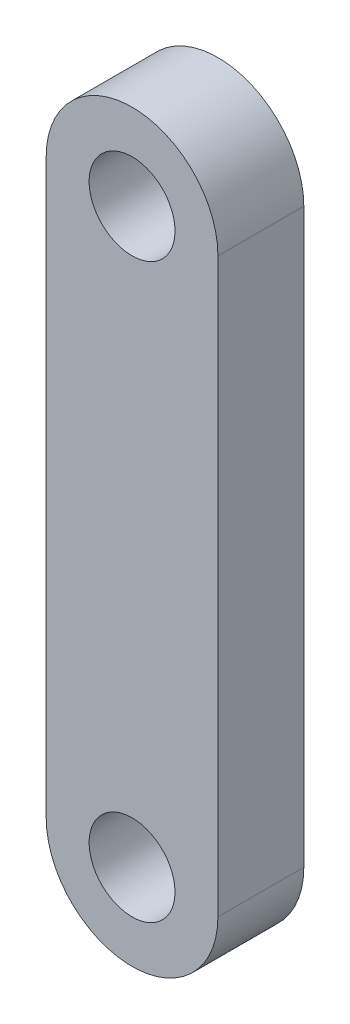
ISO-10303-21;
HEADER;
FILE_DESCRIPTION(('STEP AP214'),'2;1');
FILE_NAME('part.step','',(''),(''),'','','');
FILE_SCHEMA(('AUTOMOTIVE_DESIGN { 1 0 10303 214 1 1 1 1 }'));
ENDSEC;
DATA;
#1=APPLICATION_CONTEXT('core data for automotive mechanical design processes');
#2=APPLICATION_PROTOCOL_DEFINITION('international standard','automotive_design',2000,#1);
#3=PRODUCT_CONTEXT('',#1,'mechanical');
#4=PRODUCT('Part','Part','',(#3));
#5=PRODUCT_RELATED_PRODUCT_CATEGORY('part','',(#4));
#6=PRODUCT_DEFINITION_FORMATION('','',#4);
#7=PRODUCT_DEFINITION_CONTEXT('part definition',#1,'design');
#8=PRODUCT_DEFINITION('design','',#6,#7);
#9=PRODUCT_DEFINITION_SHAPE('','',#8);
#10=(LENGTH_UNIT() NAMED_UNIT(*) SI_UNIT(.MILLI.,.METRE.));
#11=(NAMED_UNIT(*) PLANE_ANGLE_UNIT() SI_UNIT($,.RADIAN.));
#12=(NAMED_UNIT(*) SI_UNIT($,.STERADIAN.) SOLID_ANGLE_UNIT());
#13=UNCERTAINTY_MEASURE_WITH_UNIT(LENGTH_MEASURE(1.E-05),#10,'distance_accuracy_value','');
#14=(GEOMETRIC_REPRESENTATION_CONTEXT(3) GLOBAL_UNCERTAINTY_ASSIGNED_CONTEXT((#13)) GLOBAL_UNIT_ASSIGNED_CONTEXT((#10,
#11,#12)) REPRESENTATION_CONTEXT('',''));
#15=CARTESIAN_POINT('',(0.,0.,0.));
#16=DIRECTION('',(0.,0.,1.));
#17=DIRECTION('',(1.,0.,0.));
#18=AXIS2_PLACEMENT_3D('',#15,#16,#17);
#19=CARTESIAN_POINT('',(0.,10.,-4.5));
#20=DIRECTION('',(0.,0.,1.));
#21=DIRECTION('',(1.,0.,0.));
#22=AXIS2_PLACEMENT_3D('',#19,#20,#21);
#23=CYLINDRICAL_SURFACE('',#22,3.);
#24=CARTESIAN_POINT('',(0.,10.,-1.5));
#25=DIRECTION('',(0.,0.,1.));
#26=DIRECTION('',(1.,0.,0.));
#27=AXIS2_PLACEMENT_3D('',#24,#25,#26);
#28=CIRCLE('',#27,3.);
#29=CARTESIAN_POINT('',(2.99999999999999,10.,-1.5));
#30=VERTEX_POINT('',#29);
#31=CARTESIAN_POINT('',(-3.00000000000001,10.,-1.5));
#32=VERTEX_POINT('',#31);
#33=EDGE_CURVE('E100',#30,#32,#28,.T.);
#34=ORIENTED_EDGE('',*,*,#33,.F.);
#35=DIRECTION('',(0.,0.,1.));
#36=VECTOR('',#35,1.);
#37=CARTESIAN_POINT('',(2.99999999999999,10.,-4.5));
#38=LINE('',#37,#36);
#39=CARTESIAN_POINT('',(2.99999999999999,10.,-4.5));
#40=VERTEX_POINT('',#39);
#41=EDGE_CURVE('E11',#40,#30,#38,.T.);
#42=ORIENTED_EDGE('',*,*,#41,.F.);
#43=CARTESIAN_POINT('',(0.,10.,-4.5));
#44=DIRECTION('',(0.,0.,1.));
#45=DIRECTION('',(1.,0.,0.));
#46=AXIS2_PLACEMENT_3D('',#43,#44,#45);
#47=CIRCLE('',#46,3.);
#48=CARTESIAN_POINT('',(-3.00000000000001,10.,-4.5));
#49=VERTEX_POINT('',#48);
#50=EDGE_CURVE('E93',#40,#49,#47,.T.);
#51=ORIENTED_EDGE('',*,*,#50,.T.);
#52=DIRECTION('',(0.,0.,1.));
#53=VECTOR('',#52,1.);
#54=CARTESIAN_POINT('',(-3.00000000000001,10.,-4.5));
#55=LINE('',#54,#53);
#56=EDGE_CURVE('E38',#49,#32,#55,.T.);
#57=ORIENTED_EDGE('',*,*,#56,.T.);
#58=EDGE_LOOP('',(#34,#42,#51,#57));
#59=FACE_BOUND('',#58,.T.);
#60=ADVANCED_FACE('F35',(#59),#23,.T.);
#61=CARTESIAN_POINT('',(2.99999999999999,10.,-4.5));
#62=DIRECTION('',(1.,0.,0.));
#63=DIRECTION('',(0.,0.,-1.));
#64=AXIS2_PLACEMENT_3D('',#61,#62,#63);
#65=PLANE('',#64);
#66=DIRECTION('',(0.,1.,0.));
#67=VECTOR('',#66,1.);
#68=CARTESIAN_POINT('',(2.99999999999999,10.,-1.5));
#69=LINE('',#68,#67);
#70=CARTESIAN_POINT('',(2.99999999999999,-10.,-1.5));
#71=VERTEX_POINT('',#70);
#72=EDGE_CURVE('E95',#71,#30,#69,.T.);
#73=ORIENTED_EDGE('',*,*,#72,.F.);
#74=DIRECTION('',(0.,0.,1.));
#75=VECTOR('',#74,1.);
#76=CARTESIAN_POINT('',(2.99999999999999,-10.,-4.5));
#77=LINE('',#76,#75);
#78=CARTESIAN_POINT('',(2.99999999999999,-10.,-4.5));
#79=VERTEX_POINT('',#78);
#80=EDGE_CURVE('E44',#79,#71,#77,.T.);
#81=ORIENTED_EDGE('',*,*,#80,.F.);
#82=DIRECTION('',(0.,1.,0.));
#83=VECTOR('',#82,1.);
#84=CARTESIAN_POINT('',(2.99999999999999,10.,-4.5));
#85=LINE('',#84,#83);
#86=EDGE_CURVE('E90',#79,#40,#85,.T.);
#87=ORIENTED_EDGE('',*,*,#86,.T.);
#88=ORIENTED_EDGE('',*,*,#41,.T.);
#89=EDGE_LOOP('',(#73,#81,#87,#88));
#90=FACE_BOUND('',#89,.T.);
#91=ADVANCED_FACE('F111',(#90),#65,.T.);
#92=CARTESIAN_POINT('',(0.,-10.,-4.5));
#93=DIRECTION('',(0.,0.,1.));
#94=DIRECTION('',(1.,0.,0.));
#95=AXIS2_PLACEMENT_3D('',#92,#93,#94);
#96=CYLINDRICAL_SURFACE('',#95,3.);
#97=CARTESIAN_POINT('',(0.,-10.,-1.5));
#98=DIRECTION('',(0.,0.,1.));
#99=DIRECTION('',(1.,0.,0.));
#100=AXIS2_PLACEMENT_3D('',#97,#98,#99);
#101=CIRCLE('',#100,3.);
#102=CARTESIAN_POINT('',(-3.00000000000001,-10.,-1.5));
#103=VERTEX_POINT('',#102);
#104=EDGE_CURVE('E85',#103,#71,#101,.T.);
#105=ORIENTED_EDGE('',*,*,#104,.F.);
#106=DIRECTION('',(0.,0.,1.));
#107=VECTOR('',#106,1.);
#108=CARTESIAN_POINT('',(-3.00000000000001,-10.,-4.5));
#109=LINE('',#108,#107);
#110=CARTESIAN_POINT('',(-3.00000000000001,-10.,-4.5));
#111=VERTEX_POINT('',#110);
#112=EDGE_CURVE('E80',#111,#103,#109,.T.);
#113=ORIENTED_EDGE('',*,*,#112,.F.);
#114=CARTESIAN_POINT('',(0.,-10.,-4.5));
#115=DIRECTION('',(0.,0.,1.));
#116=DIRECTION('',(1.,0.,0.));
#117=AXIS2_PLACEMENT_3D('',#114,#115,#116);
#118=CIRCLE('',#117,3.);
#119=EDGE_CURVE('E83',#111,#79,#118,.T.);
#120=ORIENTED_EDGE('',*,*,#119,.T.);
#121=ORIENTED_EDGE('',*,*,#80,.T.);
#122=EDGE_LOOP('',(#105,#113,#120,#121));
#123=FACE_BOUND('',#122,.T.);
#124=ADVANCED_FACE('F82',(#123),#96,.T.);
#125=CARTESIAN_POINT('',(-3.00000000000001,10.,-4.5));
#126=DIRECTION('',(-1.,0.,0.));
#127=DIRECTION('',(0.,-1.,0.));
#128=AXIS2_PLACEMENT_3D('',#125,#126,#127);
#129=PLANE('',#128);
#130=DIRECTION('',(0.,-1.,0.));
#131=VECTOR('',#130,1.);
#132=CARTESIAN_POINT('',(-3.00000000000001,10.,-1.5));
#133=LINE('',#132,#131);
#134=EDGE_CURVE('E103',#32,#103,#133,.T.);
#135=ORIENTED_EDGE('',*,*,#134,.F.);
#136=ORIENTED_EDGE('',*,*,#56,.F.);
#137=DIRECTION('',(0.,-1.,0.));
#138=VECTOR('',#137,1.);
#139=CARTESIAN_POINT('',(-3.00000000000001,10.,-4.5));
#140=LINE('',#139,#138);
#141=EDGE_CURVE('E89',#49,#111,#140,.T.);
#142=ORIENTED_EDGE('',*,*,#141,.T.);
#143=ORIENTED_EDGE('',*,*,#112,.T.);
#144=EDGE_LOOP('',(#135,#136,#142,#143));
#145=FACE_BOUND('',#144,.T.);
#146=ADVANCED_FACE('F92',(#145),#129,.T.);
#147=CARTESIAN_POINT('',(0.,10.,-4.5));
#148=DIRECTION('',(0.,0.,1.));
#149=DIRECTION('',(1.,0.,0.));
#150=AXIS2_PLACEMENT_3D('',#147,#148,#149);
#151=PLANE('',#150);
#152=CARTESIAN_POINT('',(0.,-10.,-4.5));
#153=DIRECTION('',(0.,0.,1.));
#154=DIRECTION('',(1.,0.,0.));
#155=AXIS2_PLACEMENT_3D('',#152,#153,#154);
#156=CIRCLE('',#155,1.5);
#157=CARTESIAN_POINT('',(1.49999999999999,-10.,-4.5));
#158=VERTEX_POINT('',#157);
#159=EDGE_CURVE('E144',#158,#158,#156,.T.);
#160=ORIENTED_EDGE('',*,*,#159,.T.);
#161=EDGE_LOOP('',(#160));
#162=FACE_BOUND('',#161,.T.);
#163=CARTESIAN_POINT('',(0.,10.,-4.5));
#164=DIRECTION('',(0.,0.,1.));
#165=DIRECTION('',(1.,0.,0.));
#166=AXIS2_PLACEMENT_3D('',#163,#164,#165);
#167=CIRCLE('',#166,1.5);
#168=CARTESIAN_POINT('',(1.49999999999999,10.,-4.5));
#169=VERTEX_POINT('',#168);
#170=EDGE_CURVE('E104',#169,#169,#167,.T.);
#171=ORIENTED_EDGE('',*,*,#170,.T.);
#172=EDGE_LOOP('',(#171));
#173=FACE_BOUND('',#172,.T.);
#174=ORIENTED_EDGE('',*,*,#50,.F.);
#175=ORIENTED_EDGE('',*,*,#86,.F.);
#176=ORIENTED_EDGE('',*,*,#119,.F.);
#177=ORIENTED_EDGE('',*,*,#141,.F.);
#178=EDGE_LOOP('',(#174,#175,#176,#177));
#179=FACE_BOUND('',#178,.T.);
#180=ADVANCED_FACE('F88',(#162,#173,#179),#151,.F.);
#181=CARTESIAN_POINT('',(0.,10.,-1.5));
#182=DIRECTION('',(0.,0.,1.));
#183=DIRECTION('',(1.,0.,0.));
#184=AXIS2_PLACEMENT_3D('',#181,#182,#183);
#185=PLANE('',#184);
#186=CARTESIAN_POINT('',(0.,-10.,-1.5));
#187=DIRECTION('',(0.,0.,1.));
#188=DIRECTION('',(1.,0.,0.));
#189=AXIS2_PLACEMENT_3D('',#186,#187,#188);
#190=CIRCLE('',#189,1.5);
#191=CARTESIAN_POINT('',(1.49999999999999,-10.,-1.5));
#192=VERTEX_POINT('',#191);
#193=EDGE_CURVE('E147',#192,#192,#190,.T.);
#194=ORIENTED_EDGE('',*,*,#193,.F.);
#195=EDGE_LOOP('',(#194));
#196=FACE_BOUND('',#195,.T.);
#197=CARTESIAN_POINT('',(0.,10.,-1.5));
#198=DIRECTION('',(0.,0.,1.));
#199=DIRECTION('',(1.,0.,0.));
#200=AXIS2_PLACEMENT_3D('',#197,#198,#199);
#201=CIRCLE('',#200,1.5);
#202=CARTESIAN_POINT('',(1.49999999999999,10.,-1.5));
#203=VERTEX_POINT('',#202);
#204=EDGE_CURVE('E149',#203,#203,#201,.T.);
#205=ORIENTED_EDGE('',*,*,#204,.F.);
#206=EDGE_LOOP('',(#205));
#207=FACE_BOUND('',#206,.T.);
#208=ORIENTED_EDGE('',*,*,#33,.T.);
#209=ORIENTED_EDGE('',*,*,#134,.T.);
#210=ORIENTED_EDGE('',*,*,#104,.T.);
#211=ORIENTED_EDGE('',*,*,#72,.T.);
#212=EDGE_LOOP('',(#208,#209,#210,#211));
#213=FACE_BOUND('',#212,.T.);
#214=ADVANCED_FACE('F110',(#196,#207,#213),#185,.T.);
#215=CARTESIAN_POINT('',(0.,10.,-4.5));
#216=DIRECTION('',(0.,0.,1.));
#217=DIRECTION('',(1.,0.,0.));
#218=AXIS2_PLACEMENT_3D('',#215,#216,#217);
#219=CYLINDRICAL_SURFACE('',#218,1.5);
#220=ORIENTED_EDGE('',*,*,#170,.F.);
#221=EDGE_LOOP('',(#220));
#222=FACE_BOUND('',#221,.T.);
#223=ORIENTED_EDGE('',*,*,#204,.T.);
#224=EDGE_LOOP('',(#223));
#225=FACE_BOUND('',#224,.T.);
#226=ADVANCED_FACE('F129',(#222,#225),#219,.F.);
#227=CARTESIAN_POINT('',(0.,-10.,-4.5));
#228=DIRECTION('',(0.,0.,1.));
#229=DIRECTION('',(1.,0.,0.));
#230=AXIS2_PLACEMENT_3D('',#227,#228,#229);
#231=CYLINDRICAL_SURFACE('',#230,1.5);
#232=ORIENTED_EDGE('',*,*,#159,.F.);
#233=EDGE_LOOP('',(#232));
#234=FACE_BOUND('',#233,.T.);
#235=ORIENTED_EDGE('',*,*,#193,.T.);
#236=EDGE_LOOP('',(#235));
#237=FACE_BOUND('',#236,.T.);
#238=ADVANCED_FACE('F136',(#234,#237),#231,.F.);
#239=CLOSED_SHELL('',(#60,#91,#124,#146,#180,#214,#226,#238));
#240=MANIFOLD_SOLID_BREP('B2',#239);
#241=ADVANCED_BREP_SHAPE_REPRESENTATION('',(#18,#240),#14);
#242=SHAPE_DEFINITION_REPRESENTATION(#9,#241);
ENDSEC;
END-ISO-10303-21;
